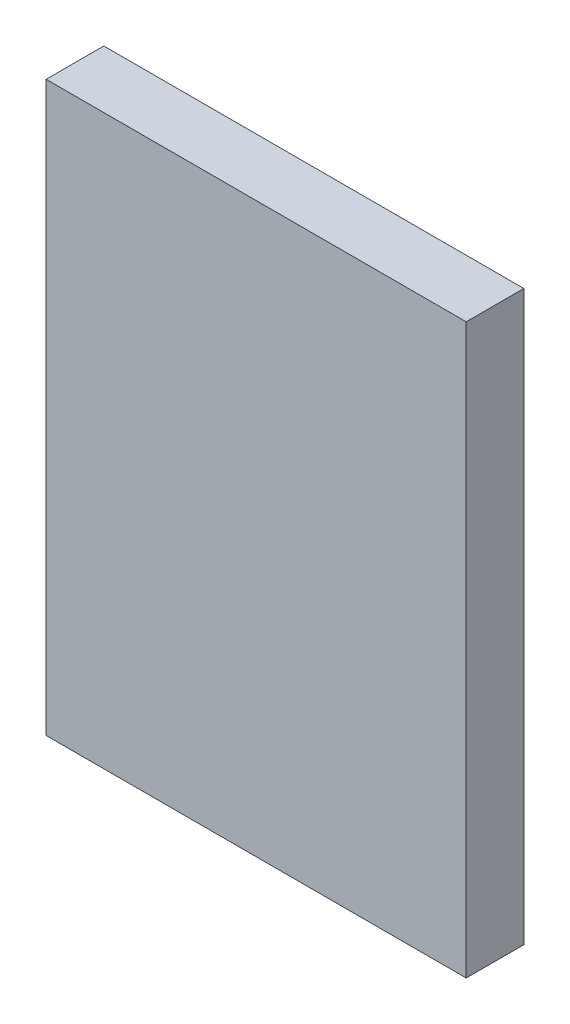
ISO-10303-21;
HEADER;
FILE_DESCRIPTION(('STEP AP214'),'2;1');
FILE_NAME('part.step','',(''),(''),'','','');
FILE_SCHEMA(('AUTOMOTIVE_DESIGN { 1 0 10303 214 1 1 1 1 }'));
ENDSEC;
DATA;
#1=APPLICATION_CONTEXT('core data for automotive mechanical design processes');
#2=APPLICATION_PROTOCOL_DEFINITION('international standard','automotive_design',2000,#1);
#3=PRODUCT_CONTEXT('',#1,'mechanical');
#4=PRODUCT('Part','Part','',(#3));
#5=PRODUCT_RELATED_PRODUCT_CATEGORY('part','',(#4));
#6=PRODUCT_DEFINITION_FORMATION('','',#4);
#7=PRODUCT_DEFINITION_CONTEXT('part definition',#1,'design');
#8=PRODUCT_DEFINITION('design','',#6,#7);
#9=PRODUCT_DEFINITION_SHAPE('','',#8);
#10=(LENGTH_UNIT() NAMED_UNIT(*) SI_UNIT(.MILLI.,.METRE.));
#11=(NAMED_UNIT(*) PLANE_ANGLE_UNIT() SI_UNIT($,.RADIAN.));
#12=(NAMED_UNIT(*) SI_UNIT($,.STERADIAN.) SOLID_ANGLE_UNIT());
#13=UNCERTAINTY_MEASURE_WITH_UNIT(LENGTH_MEASURE(1.E-05),#10,'distance_accuracy_value','');
#14=(GEOMETRIC_REPRESENTATION_CONTEXT(3) GLOBAL_UNCERTAINTY_ASSIGNED_CONTEXT((#13)) GLOBAL_UNIT_ASSIGNED_CONTEXT((#10,
#11,#12)) REPRESENTATION_CONTEXT('',''));
#15=CARTESIAN_POINT('',(0.,0.,0.));
#16=DIRECTION('',(0.,0.,1.));
#17=DIRECTION('',(1.,0.,0.));
#18=AXIS2_PLACEMENT_3D('',#15,#16,#17);
#19=CARTESIAN_POINT('',(-2.54949198,3.44949272,0.7));
#20=DIRECTION('',(0.,0.,-1.));
#21=DIRECTION('',(-1.,0.,0.));
#22=AXIS2_PLACEMENT_3D('',#19,#20,#21);
#23=PLANE('',#22);
#24=DIRECTION('',(1.,0.,0.));
#25=VECTOR('',#24,1.);
#26=CARTESIAN_POINT('',(-2.54949198,-3.44949018,0.7));
#27=LINE('',#26,#25);
#28=CARTESIAN_POINT('',(-2.54949198,-3.44949018,0.7));
#29=VERTEX_POINT('',#28);
#30=CARTESIAN_POINT('',(2.54949198,-3.44949018,0.7));
#31=VERTEX_POINT('',#30);
#32=EDGE_CURVE('E79',#29,#31,#27,.T.);
#33=ORIENTED_EDGE('',*,*,#32,.T.);
#34=DIRECTION('',(0.,1.,0.));
#35=VECTOR('',#34,1.);
#36=CARTESIAN_POINT('',(2.54949198,-3.44949018,0.7));
#37=LINE('',#36,#35);
#38=CARTESIAN_POINT('',(2.54949198,3.44949272,0.7));
#39=VERTEX_POINT('',#38);
#40=EDGE_CURVE('E55',#31,#39,#37,.T.);
#41=ORIENTED_EDGE('',*,*,#40,.T.);
#42=DIRECTION('',(1.,0.,0.));
#43=VECTOR('',#42,1.);
#44=CARTESIAN_POINT('',(2.54949198,3.44949272,0.7));
#45=LINE('',#44,#43);
#46=CARTESIAN_POINT('',(-2.54949198,3.44949272,0.7));
#47=VERTEX_POINT('',#46);
#48=EDGE_CURVE('E57',#39,#47,#45,.F.);
#49=ORIENTED_EDGE('',*,*,#48,.T.);
#50=DIRECTION('',(0.,1.,0.));
#51=VECTOR('',#50,1.);
#52=CARTESIAN_POINT('',(-2.54949198,3.44949272,0.7));
#53=LINE('',#52,#51);
#54=EDGE_CURVE('E20',#47,#29,#53,.F.);
#55=ORIENTED_EDGE('',*,*,#54,.T.);
#56=EDGE_LOOP('',(#33,#41,#49,#55));
#57=FACE_BOUND('',#56,.T.);
#58=ADVANCED_FACE('F17',(#57),#23,.F.);
#59=CARTESIAN_POINT('',(-2.54949198,3.44949272,0.));
#60=DIRECTION('',(1.,0.,0.));
#61=DIRECTION('',(0.,0.,-1.));
#62=AXIS2_PLACEMENT_3D('',#59,#60,#61);
#63=PLANE('',#62);
#64=DIRECTION('',(0.,1.,0.));
#65=VECTOR('',#64,1.);
#66=CARTESIAN_POINT('',(-2.54949198,3.44949272,0.));
#67=LINE('',#66,#65);
#68=CARTESIAN_POINT('',(-2.54949198,-3.44949018,0.));
#69=VERTEX_POINT('',#68);
#70=CARTESIAN_POINT('',(-2.54949198,3.44949272,0.));
#71=VERTEX_POINT('',#70);
#72=EDGE_CURVE('E83',#69,#71,#67,.T.);
#73=ORIENTED_EDGE('',*,*,#72,.F.);
#74=DIRECTION('',(0.,0.,1.));
#75=VECTOR('',#74,1.);
#76=CARTESIAN_POINT('',(-2.54949198,-3.44949018,0.));
#77=LINE('',#76,#75);
#78=EDGE_CURVE('E68',#69,#29,#77,.T.);
#79=ORIENTED_EDGE('',*,*,#78,.T.);
#80=ORIENTED_EDGE('',*,*,#54,.F.);
#81=DIRECTION('',(0.,0.,-1.));
#82=VECTOR('',#81,1.);
#83=CARTESIAN_POINT('',(-2.54949198,3.44949272,0.));
#84=LINE('',#83,#82);
#85=EDGE_CURVE('E63',#47,#71,#84,.T.);
#86=ORIENTED_EDGE('',*,*,#85,.T.);
#87=EDGE_LOOP('',(#73,#79,#80,#86));
#88=FACE_BOUND('',#87,.T.);
#89=ADVANCED_FACE('F65',(#88),#63,.F.);
#90=CARTESIAN_POINT('',(2.54949198,3.44949272,0.));
#91=DIRECTION('',(0.,-1.,0.));
#92=DIRECTION('',(0.,0.,-1.));
#93=AXIS2_PLACEMENT_3D('',#90,#91,#92);
#94=PLANE('',#93);
#95=DIRECTION('',(-1.,0.,0.));
#96=VECTOR('',#95,1.);
#97=CARTESIAN_POINT('',(-2.54949198,3.44949272,0.));
#98=LINE('',#97,#96);
#99=CARTESIAN_POINT('',(2.54949198,3.44949272,0.));
#100=VERTEX_POINT('',#99);
#101=EDGE_CURVE('E72',#71,#100,#98,.F.);
#102=ORIENTED_EDGE('',*,*,#101,.F.);
#103=ORIENTED_EDGE('',*,*,#85,.F.);
#104=ORIENTED_EDGE('',*,*,#48,.F.);
#105=DIRECTION('',(0.,0.,1.));
#106=VECTOR('',#105,1.);
#107=CARTESIAN_POINT('',(2.54949198,3.44949272,0.));
#108=LINE('',#107,#106);
#109=EDGE_CURVE('E75',#39,#100,#108,.F.);
#110=ORIENTED_EDGE('',*,*,#109,.T.);
#111=EDGE_LOOP('',(#102,#103,#104,#110));
#112=FACE_BOUND('',#111,.T.);
#113=ADVANCED_FACE('F70',(#112),#94,.F.);
#114=CARTESIAN_POINT('',(2.54949198,-3.44949018,0.));
#115=DIRECTION('',(-1.,0.,0.));
#116=DIRECTION('',(0.,0.,1.));
#117=AXIS2_PLACEMENT_3D('',#114,#115,#116);
#118=PLANE('',#117);
#119=DIRECTION('',(0.,1.,0.));
#120=VECTOR('',#119,1.);
#121=CARTESIAN_POINT('',(2.54949198,3.44949272,0.));
#122=LINE('',#121,#120);
#123=CARTESIAN_POINT('',(2.54949198,-3.44949018,0.));
#124=VERTEX_POINT('',#123);
#125=EDGE_CURVE('E26',#100,#124,#122,.F.);
#126=ORIENTED_EDGE('',*,*,#125,.F.);
#127=ORIENTED_EDGE('',*,*,#109,.F.);
#128=ORIENTED_EDGE('',*,*,#40,.F.);
#129=DIRECTION('',(0.,0.,1.));
#130=VECTOR('',#129,1.);
#131=CARTESIAN_POINT('',(2.54949198,-3.44949018,0.));
#132=LINE('',#131,#130);
#133=EDGE_CURVE('E35',#31,#124,#132,.F.);
#134=ORIENTED_EDGE('',*,*,#133,.T.);
#135=EDGE_LOOP('',(#126,#127,#128,#134));
#136=FACE_BOUND('',#135,.T.);
#137=ADVANCED_FACE('F89',(#136),#118,.F.);
#138=CARTESIAN_POINT('',(-2.54949198,-3.44949018,0.));
#139=DIRECTION('',(0.,1.,0.));
#140=DIRECTION('',(0.,0.,1.));
#141=AXIS2_PLACEMENT_3D('',#138,#139,#140);
#142=PLANE('',#141);
#143=DIRECTION('',(-1.,0.,0.));
#144=VECTOR('',#143,1.);
#145=CARTESIAN_POINT('',(-2.54949198,-3.44949018,0.));
#146=LINE('',#145,#144);
#147=EDGE_CURVE('E11',#124,#69,#146,.T.);
#148=ORIENTED_EDGE('',*,*,#147,.F.);
#149=ORIENTED_EDGE('',*,*,#133,.F.);
#150=ORIENTED_EDGE('',*,*,#32,.F.);
#151=ORIENTED_EDGE('',*,*,#78,.F.);
#152=EDGE_LOOP('',(#148,#149,#150,#151));
#153=FACE_BOUND('',#152,.T.);
#154=ADVANCED_FACE('F91',(#153),#142,.F.);
#155=CARTESIAN_POINT('',(-2.54949198,3.44949272,0.));
#156=DIRECTION('',(0.,0.,-1.));
#157=DIRECTION('',(-1.,0.,0.));
#158=AXIS2_PLACEMENT_3D('',#155,#156,#157);
#159=PLANE('',#158);
#160=ORIENTED_EDGE('',*,*,#125,.T.);
#161=ORIENTED_EDGE('',*,*,#147,.T.);
#162=ORIENTED_EDGE('',*,*,#72,.T.);
#163=ORIENTED_EDGE('',*,*,#101,.T.);
#164=EDGE_LOOP('',(#160,#161,#162,#163));
#165=FACE_BOUND('',#164,.T.);
#166=ADVANCED_FACE('F88',(#165),#159,.T.);
#167=CLOSED_SHELL('',(#58,#89,#113,#137,#154,#166));
#168=MANIFOLD_SOLID_BREP('B1',#167);
#169=ADVANCED_BREP_SHAPE_REPRESENTATION('',(#18,#168),#14);
#170=SHAPE_DEFINITION_REPRESENTATION(#9,#169);
ENDSEC;
END-ISO-10303-21;
